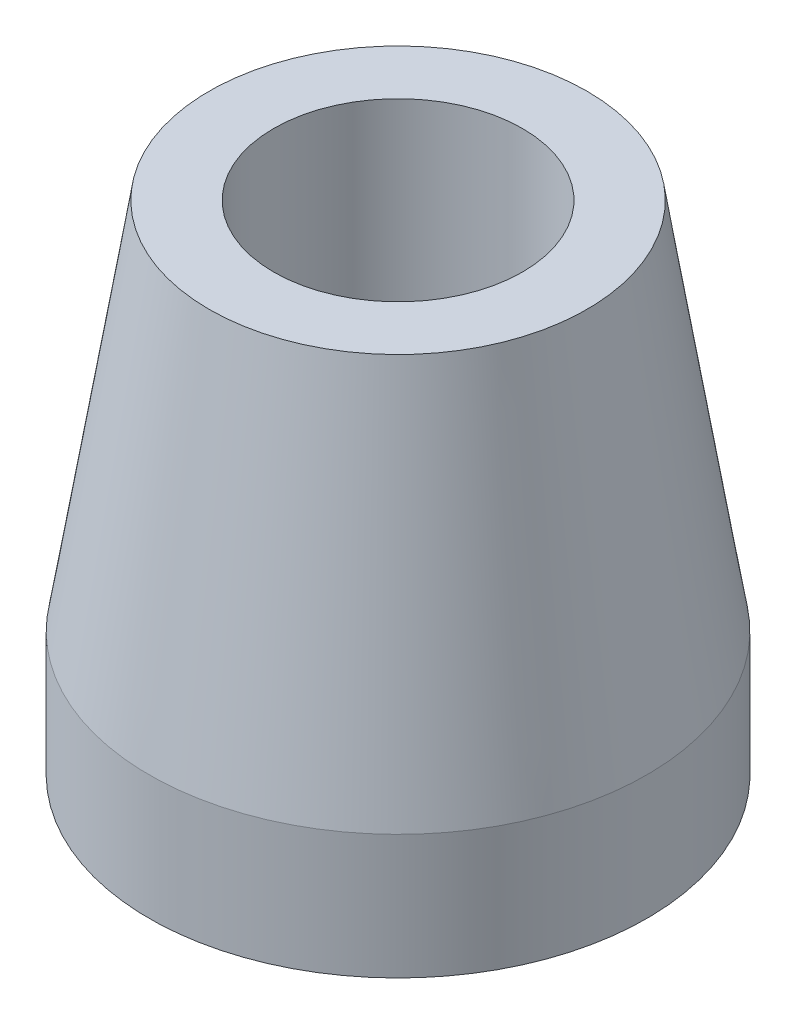
ISO-10303-21;
HEADER;
FILE_DESCRIPTION(('STEP AP214'),'2;1');
FILE_NAME('part.step','',(''),(''),'','','');
FILE_SCHEMA(('AUTOMOTIVE_DESIGN { 1 0 10303 214 1 1 1 1 }'));
ENDSEC;
DATA;
#1=APPLICATION_CONTEXT('core data for automotive mechanical design processes');
#2=APPLICATION_PROTOCOL_DEFINITION('international standard','automotive_design',2000,#1);
#3=PRODUCT_CONTEXT('',#1,'mechanical');
#4=PRODUCT('Part','Part','',(#3));
#5=PRODUCT_RELATED_PRODUCT_CATEGORY('part','',(#4));
#6=PRODUCT_DEFINITION_FORMATION('','',#4);
#7=PRODUCT_DEFINITION_CONTEXT('part definition',#1,'design');
#8=PRODUCT_DEFINITION('design','',#6,#7);
#9=PRODUCT_DEFINITION_SHAPE('','',#8);
#10=(LENGTH_UNIT() NAMED_UNIT(*) SI_UNIT(.MILLI.,.METRE.));
#11=(NAMED_UNIT(*) PLANE_ANGLE_UNIT() SI_UNIT($,.RADIAN.));
#12=(NAMED_UNIT(*) SI_UNIT($,.STERADIAN.) SOLID_ANGLE_UNIT());
#13=UNCERTAINTY_MEASURE_WITH_UNIT(LENGTH_MEASURE(1.E-05),#10,'distance_accuracy_value','');
#14=(GEOMETRIC_REPRESENTATION_CONTEXT(3) GLOBAL_UNCERTAINTY_ASSIGNED_CONTEXT((#13)) GLOBAL_UNIT_ASSIGNED_CONTEXT((#10,
#11,#12)) REPRESENTATION_CONTEXT('',''));
#15=CARTESIAN_POINT('',(0.,0.,0.));
#16=DIRECTION('',(0.,0.,1.));
#17=DIRECTION('',(1.,0.,0.));
#18=AXIS2_PLACEMENT_3D('',#15,#16,#17);
#19=CARTESIAN_POINT('',(0.,0.,0.));
#20=DIRECTION('',(0.,1.,0.));
#21=DIRECTION('',(0.,0.,1.));
#22=AXIS2_PLACEMENT_3D('',#19,#20,#21);
#23=PLANE('',#22);
#24=CARTESIAN_POINT('',(0.,0.,0.));
#25=DIRECTION('',(0.,-1.,0.));
#26=DIRECTION('',(0.,0.,-1.));
#27=AXIS2_PLACEMENT_3D('',#24,#25,#26);
#28=CIRCLE('',#27,2.5);
#29=CARTESIAN_POINT('',(0.,0.,-2.5));
#30=VERTEX_POINT('',#29);
#31=EDGE_CURVE('E10',#30,#30,#28,.T.);
#32=ORIENTED_EDGE('',*,*,#31,.F.);
#33=EDGE_LOOP('',(#32));
#34=FACE_BOUND('',#33,.T.);
#35=ADVANCED_FACE('F31',(#34),#23,.T.);
#36=CARTESIAN_POINT('',(0.,-2.5,0.));
#37=DIRECTION('',(0.,-1.,0.));
#38=DIRECTION('',(0.,0.,-1.));
#39=AXIS2_PLACEMENT_3D('',#36,#37,#38);
#40=CYLINDRICAL_SURFACE('',#39,2.5);
#41=ORIENTED_EDGE('',*,*,#31,.T.);
#42=EDGE_LOOP('',(#41));
#43=FACE_BOUND('',#42,.T.);
#44=CARTESIAN_POINT('',(0.,7.5,0.));
#45=DIRECTION('',(0.,-1.,0.));
#46=DIRECTION('',(0.,0.,-1.));
#47=AXIS2_PLACEMENT_3D('',#44,#45,#46);
#48=CIRCLE('',#47,2.5);
#49=CARTESIAN_POINT('',(0.,7.5,-2.5));
#50=VERTEX_POINT('',#49);
#51=EDGE_CURVE('E37',#50,#50,#48,.T.);
#52=ORIENTED_EDGE('',*,*,#51,.F.);
#53=EDGE_LOOP('',(#52));
#54=FACE_BOUND('',#53,.T.);
#55=ADVANCED_FACE('F70',(#43,#54),#40,.F.);
#56=CARTESIAN_POINT('',(2.5,7.5,0.));
#57=DIRECTION('',(0.,1.,0.));
#58=DIRECTION('',(0.,0.,1.));
#59=AXIS2_PLACEMENT_3D('',#56,#57,#58);
#60=PLANE('',#59);
#61=ORIENTED_EDGE('',*,*,#51,.T.);
#62=EDGE_LOOP('',(#61));
#63=FACE_BOUND('',#62,.T.);
#64=CARTESIAN_POINT('',(0.,7.5,0.));
#65=DIRECTION('',(0.,-1.,0.));
#66=DIRECTION('',(0.,0.,-1.));
#67=AXIS2_PLACEMENT_3D('',#64,#65,#66);
#68=CIRCLE('',#67,3.79746835443038);
#69=CARTESIAN_POINT('',(0.,7.5,-3.79746835443038));
#70=VERTEX_POINT('',#69);
#71=EDGE_CURVE('E41',#70,#70,#68,.T.);
#72=ORIENTED_EDGE('',*,*,#71,.F.);
#73=EDGE_LOOP('',(#72));
#74=FACE_BOUND('',#73,.T.);
#75=ADVANCED_FACE('F66',(#63,#74),#60,.T.);
#76=CARTESIAN_POINT('',(0.,0.,0.));
#77=DIRECTION('',(0.,-1.,0.));
#78=DIRECTION('',(0.,0.,-1.));
#79=AXIS2_PLACEMENT_3D('',#76,#77,#78);
#80=CONICAL_SURFACE('',#79,5.,0.158984371932623);
#81=ORIENTED_EDGE('',*,*,#71,.T.);
#82=EDGE_LOOP('',(#81));
#83=FACE_BOUND('',#82,.T.);
#84=CARTESIAN_POINT('',(0.,0.,0.));
#85=DIRECTION('',(0.,-1.,0.));
#86=DIRECTION('',(0.,0.,-1.));
#87=AXIS2_PLACEMENT_3D('',#84,#85,#86);
#88=CIRCLE('',#87,5.);
#89=CARTESIAN_POINT('',(0.,0.,-5.));
#90=VERTEX_POINT('',#89);
#91=EDGE_CURVE('E45',#90,#90,#88,.T.);
#92=ORIENTED_EDGE('',*,*,#91,.F.);
#93=EDGE_LOOP('',(#92));
#94=FACE_BOUND('',#93,.T.);
#95=ADVANCED_FACE('F58',(#83,#94),#80,.T.);
#96=CARTESIAN_POINT('',(0.,-2.5,0.));
#97=DIRECTION('',(0.,-1.,0.));
#98=DIRECTION('',(0.,0.,-1.));
#99=AXIS2_PLACEMENT_3D('',#96,#97,#98);
#100=CYLINDRICAL_SURFACE('',#99,5.);
#101=ORIENTED_EDGE('',*,*,#91,.T.);
#102=EDGE_LOOP('',(#101));
#103=FACE_BOUND('',#102,.T.);
#104=CARTESIAN_POINT('',(0.,-2.5,0.));
#105=DIRECTION('',(0.,-1.,0.));
#106=DIRECTION('',(0.,0.,-1.));
#107=AXIS2_PLACEMENT_3D('',#104,#105,#106);
#108=CIRCLE('',#107,5.);
#109=CARTESIAN_POINT('',(0.,-2.5,-5.));
#110=VERTEX_POINT('',#109);
#111=EDGE_CURVE('E50',#110,#110,#108,.T.);
#112=ORIENTED_EDGE('',*,*,#111,.F.);
#113=EDGE_LOOP('',(#112));
#114=FACE_BOUND('',#113,.T.);
#115=ADVANCED_FACE('F56',(#103,#114),#100,.T.);
#116=CARTESIAN_POINT('',(5.,-2.5,0.));
#117=DIRECTION('',(0.,-1.,0.));
#118=DIRECTION('',(0.,0.,-1.));
#119=AXIS2_PLACEMENT_3D('',#116,#117,#118);
#120=PLANE('',#119);
#121=ORIENTED_EDGE('',*,*,#111,.T.);
#122=EDGE_LOOP('',(#121));
#123=FACE_BOUND('',#122,.T.);
#124=ADVANCED_FACE('F54',(#123),#120,.T.);
#125=CLOSED_SHELL('',(#35,#55,#75,#95,#115,#124));
#126=MANIFOLD_SOLID_BREP('B2',#125);
#127=ADVANCED_BREP_SHAPE_REPRESENTATION('',(#18,#126),#14);
#128=SHAPE_DEFINITION_REPRESENTATION(#9,#127);
ENDSEC;
END-ISO-10303-21;
